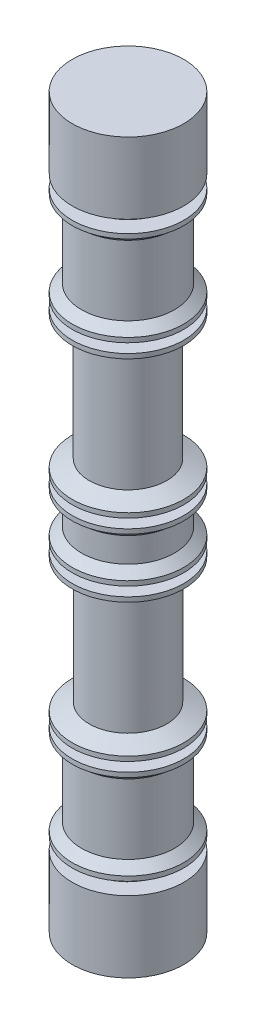
ISO-10303-21;
HEADER;
FILE_DESCRIPTION(('STEP AP214'),'2;1');
FILE_NAME('part.step','',(''),(''),'','','');
FILE_SCHEMA(('AUTOMOTIVE_DESIGN { 1 0 10303 214 1 1 1 1 }'));
ENDSEC;
DATA;
#1=APPLICATION_CONTEXT('core data for automotive mechanical design processes');
#2=APPLICATION_PROTOCOL_DEFINITION('international standard','automotive_design',2000,#1);
#3=PRODUCT_CONTEXT('',#1,'mechanical');
#4=PRODUCT('Part','Part','',(#3));
#5=PRODUCT_RELATED_PRODUCT_CATEGORY('part','',(#4));
#6=PRODUCT_DEFINITION_FORMATION('','',#4);
#7=PRODUCT_DEFINITION_CONTEXT('part definition',#1,'design');
#8=PRODUCT_DEFINITION('design','',#6,#7);
#9=PRODUCT_DEFINITION_SHAPE('','',#8);
#10=(LENGTH_UNIT() NAMED_UNIT(*) SI_UNIT(.MILLI.,.METRE.));
#11=(NAMED_UNIT(*) PLANE_ANGLE_UNIT() SI_UNIT($,.RADIAN.));
#12=(NAMED_UNIT(*) SI_UNIT($,.STERADIAN.) SOLID_ANGLE_UNIT());
#13=UNCERTAINTY_MEASURE_WITH_UNIT(LENGTH_MEASURE(1.E-05),#10,'distance_accuracy_value','');
#14=(GEOMETRIC_REPRESENTATION_CONTEXT(3) GLOBAL_UNCERTAINTY_ASSIGNED_CONTEXT((#13)) GLOBAL_UNIT_ASSIGNED_CONTEXT((#10,
#11,#12)) REPRESENTATION_CONTEXT('',''));
#15=CARTESIAN_POINT('',(0.,0.,0.));
#16=DIRECTION('',(0.,0.,1.));
#17=DIRECTION('',(1.,0.,0.));
#18=AXIS2_PLACEMENT_3D('',#15,#16,#17);
#19=CARTESIAN_POINT('',(0.,0.8,0.));
#20=DIRECTION('',(0.,-1.,0.));
#21=DIRECTION('',(0.,0.,-1.));
#22=AXIS2_PLACEMENT_3D('',#19,#20,#21);
#23=CYLINDRICAL_SURFACE('',#22,3.);
#24=CARTESIAN_POINT('',(0.,0.8,0.));
#25=DIRECTION('',(0.,1.,0.));
#26=DIRECTION('',(0.,0.,1.));
#27=AXIS2_PLACEMENT_3D('',#24,#25,#26);
#28=CIRCLE('',#27,3.);
#29=CARTESIAN_POINT('',(0.,0.8,3.));
#30=VERTEX_POINT('',#29);
#31=EDGE_CURVE('E42',#30,#30,#28,.T.);
#32=ORIENTED_EDGE('',*,*,#31,.F.);
#33=EDGE_LOOP('',(#32));
#34=FACE_BOUND('',#33,.T.);
#35=CARTESIAN_POINT('',(0.,-0.799999999999998,0.));
#36=DIRECTION('',(0.,1.,0.));
#37=DIRECTION('',(-1.,0.,0.));
#38=AXIS2_PLACEMENT_3D('',#35,#36,#37);
#39=CIRCLE('',#38,3.);
#40=CARTESIAN_POINT('',(-3.,-0.799999999999997,0.));
#41=VERTEX_POINT('',#40);
#42=EDGE_CURVE('E156',#41,#41,#39,.T.);
#43=ORIENTED_EDGE('',*,*,#42,.T.);
#44=EDGE_LOOP('',(#43));
#45=FACE_BOUND('',#44,.T.);
#46=ADVANCED_FACE('F39',(#34,#45),#23,.T.);
#47=CARTESIAN_POINT('',(0.,0.799999999999998,0.));
#48=DIRECTION('',(0.,1.,0.));
#49=DIRECTION('',(-1.,0.,0.));
#50=AXIS2_PLACEMENT_3D('',#47,#48,#49);
#51=CONICAL_SURFACE('',#50,3.,0.876058050598193);
#52=CARTESIAN_POINT('',(0.,1.3,0.));
#53=DIRECTION('',(0.,1.,0.));
#54=DIRECTION('',(-1.,0.,0.));
#55=AXIS2_PLACEMENT_3D('',#52,#53,#54);
#56=CIRCLE('',#55,3.6);
#57=CARTESIAN_POINT('',(-3.6,1.3,0.));
#58=VERTEX_POINT('',#57);
#59=EDGE_CURVE('E229',#58,#58,#56,.T.);
#60=ORIENTED_EDGE('',*,*,#59,.F.);
#61=EDGE_LOOP('',(#60));
#62=FACE_BOUND('',#61,.T.);
#63=ORIENTED_EDGE('',*,*,#31,.T.);
#64=EDGE_LOOP('',(#63));
#65=FACE_BOUND('',#64,.T.);
#66=ADVANCED_FACE('F238',(#62,#65),#51,.T.);
#67=CARTESIAN_POINT('',(0.,1.6,0.));
#68=DIRECTION('',(0.,1.,0.));
#69=DIRECTION('',(-1.,0.,0.));
#70=AXIS2_PLACEMENT_3D('',#67,#68,#69);
#71=CYLINDRICAL_SURFACE('',#70,3.6);
#72=CARTESIAN_POINT('',(0.,1.6,0.));
#73=DIRECTION('',(0.,1.,0.));
#74=DIRECTION('',(-1.,0.,0.));
#75=AXIS2_PLACEMENT_3D('',#72,#73,#74);
#76=CIRCLE('',#75,3.6);
#77=CARTESIAN_POINT('',(-3.6,1.6,0.));
#78=VERTEX_POINT('',#77);
#79=EDGE_CURVE('E223',#78,#78,#76,.T.);
#80=ORIENTED_EDGE('',*,*,#79,.F.);
#81=EDGE_LOOP('',(#80));
#82=FACE_BOUND('',#81,.T.);
#83=ORIENTED_EDGE('',*,*,#59,.T.);
#84=EDGE_LOOP('',(#83));
#85=FACE_BOUND('',#84,.T.);
#86=ADVANCED_FACE('F340',(#82,#85),#71,.T.);
#87=CARTESIAN_POINT('',(3.6,1.6,0.));
#88=DIRECTION('',(0.,-1.,0.));
#89=DIRECTION('',(1.,0.,0.));
#90=AXIS2_PLACEMENT_3D('',#87,#88,#89);
#91=PLANE('',#90);
#92=CARTESIAN_POINT('',(0.,1.6,0.));
#93=DIRECTION('',(0.,1.,0.));
#94=DIRECTION('',(-1.,0.,0.));
#95=AXIS2_PLACEMENT_3D('',#92,#93,#94);
#96=CIRCLE('',#95,2.5);
#97=CARTESIAN_POINT('',(-2.5,1.6,0.));
#98=VERTEX_POINT('',#97);
#99=EDGE_CURVE('E195',#98,#98,#96,.T.);
#100=ORIENTED_EDGE('',*,*,#99,.F.);
#101=EDGE_LOOP('',(#100));
#102=FACE_BOUND('',#101,.T.);
#103=ORIENTED_EDGE('',*,*,#79,.T.);
#104=EDGE_LOOP('',(#103));
#105=FACE_BOUND('',#104,.T.);
#106=ADVANCED_FACE('F336',(#102,#105),#91,.F.);
#107=CARTESIAN_POINT('',(0.,2.2,0.));
#108=DIRECTION('',(0.,-1.,0.));
#109=DIRECTION('',(1.,0.,0.));
#110=AXIS2_PLACEMENT_3D('',#107,#108,#109);
#111=CYLINDRICAL_SURFACE('',#110,2.5);
#112=CARTESIAN_POINT('',(0.,2.2,0.));
#113=DIRECTION('',(0.,1.,0.));
#114=DIRECTION('',(-1.,0.,0.));
#115=AXIS2_PLACEMENT_3D('',#112,#113,#114);
#116=CIRCLE('',#115,2.5);
#117=CARTESIAN_POINT('',(-2.5,2.2,0.));
#118=VERTEX_POINT('',#117);
#119=EDGE_CURVE('E219',#118,#118,#116,.T.);
#120=ORIENTED_EDGE('',*,*,#119,.F.);
#121=EDGE_LOOP('',(#120));
#122=FACE_BOUND('',#121,.T.);
#123=ORIENTED_EDGE('',*,*,#99,.T.);
#124=EDGE_LOOP('',(#123));
#125=FACE_BOUND('',#124,.T.);
#126=ADVANCED_FACE('F332',(#122,#125),#111,.T.);
#127=CARTESIAN_POINT('',(0.,2.2,0.));
#128=DIRECTION('',(0.,-1.,0.));
#129=DIRECTION('',(0.,0.,-1.));
#130=AXIS2_PLACEMENT_3D('',#127,#128,#129);
#131=PLANE('',#130);
#132=ORIENTED_EDGE('',*,*,#119,.T.);
#133=EDGE_LOOP('',(#132));
#134=FACE_BOUND('',#133,.T.);
#135=CARTESIAN_POINT('',(0.,2.2,0.));
#136=DIRECTION('',(0.,-1.,0.));
#137=DIRECTION('',(0.,0.,-1.));
#138=AXIS2_PLACEMENT_3D('',#135,#136,#137);
#139=CIRCLE('',#138,3.6);
#140=CARTESIAN_POINT('',(0.,2.2,-3.6));
#141=VERTEX_POINT('',#140);
#142=EDGE_CURVE('E215',#141,#141,#139,.T.);
#143=ORIENTED_EDGE('',*,*,#142,.T.);
#144=EDGE_LOOP('',(#143));
#145=FACE_BOUND('',#144,.T.);
#146=ADVANCED_FACE('F328',(#134,#145),#131,.T.);
#147=CARTESIAN_POINT('',(0.,2.2,0.));
#148=DIRECTION('',(0.,-1.,0.));
#149=DIRECTION('',(0.,0.,-1.));
#150=AXIS2_PLACEMENT_3D('',#147,#148,#149);
#151=CYLINDRICAL_SURFACE('',#150,3.6);
#152=CARTESIAN_POINT('',(0.,2.5,0.));
#153=DIRECTION('',(0.,-1.,0.));
#154=DIRECTION('',(0.,0.,-1.));
#155=AXIS2_PLACEMENT_3D('',#152,#153,#154);
#156=CIRCLE('',#155,3.6);
#157=CARTESIAN_POINT('',(0.,2.5,-3.6));
#158=VERTEX_POINT('',#157);
#159=EDGE_CURVE('E208',#158,#158,#156,.T.);
#160=ORIENTED_EDGE('',*,*,#159,.T.);
#161=EDGE_LOOP('',(#160));
#162=FACE_BOUND('',#161,.T.);
#163=ORIENTED_EDGE('',*,*,#142,.F.);
#164=EDGE_LOOP('',(#163));
#165=FACE_BOUND('',#164,.T.);
#166=ADVANCED_FACE('F324',(#162,#165),#151,.T.);
#167=CARTESIAN_POINT('',(0.,2.5,0.));
#168=DIRECTION('',(0.,-1.,0.));
#169=DIRECTION('',(0.,0.,-1.));
#170=AXIS2_PLACEMENT_3D('',#167,#168,#169);
#171=CONICAL_SURFACE('',#170,3.6,1.14416883366802);
#172=CARTESIAN_POINT('',(0.,3.,0.));
#173=DIRECTION('',(0.,1.,0.));
#174=DIRECTION('',(-1.,0.,0.));
#175=AXIS2_PLACEMENT_3D('',#172,#173,#174);
#176=CIRCLE('',#175,2.5);
#177=CARTESIAN_POINT('',(2.5,3.,0.));
#178=VERTEX_POINT('',#177);
#179=EDGE_CURVE('E203',#178,#178,#176,.T.);
#180=ORIENTED_EDGE('',*,*,#179,.F.);
#181=EDGE_LOOP('',(#180));
#182=FACE_BOUND('',#181,.T.);
#183=ORIENTED_EDGE('',*,*,#159,.F.);
#184=EDGE_LOOP('',(#183));
#185=FACE_BOUND('',#184,.T.);
#186=ADVANCED_FACE('F320',(#182,#185),#171,.T.);
#187=CARTESIAN_POINT('',(0.,10.6,0.));
#188=DIRECTION('',(0.,-1.,0.));
#189=DIRECTION('',(1.,0.,0.));
#190=AXIS2_PLACEMENT_3D('',#187,#188,#189);
#191=CYLINDRICAL_SURFACE('',#190,2.5);
#192=CARTESIAN_POINT('',(0.,10.6,0.));
#193=DIRECTION('',(0.,1.,0.));
#194=DIRECTION('',(-1.,0.,0.));
#195=AXIS2_PLACEMENT_3D('',#192,#193,#194);
#196=CIRCLE('',#195,2.5);
#197=CARTESIAN_POINT('',(2.49999999999999,10.6,0.));
#198=VERTEX_POINT('',#197);
#199=EDGE_CURVE('E204',#198,#198,#196,.T.);
#200=CARTESIAN_POINT('',(2.49999999999999,10.6,0.));
#201=CARTESIAN_POINT('',(2.49999999999999,10.5208333333333,0.));
#202=CARTESIAN_POINT('',(2.49999999999999,10.4416666666667,0.));
#203=CARTESIAN_POINT('',(2.49999999999999,10.2833333333333,0.));
#204=CARTESIAN_POINT('',(2.5,10.2041666666667,0.));
#205=CARTESIAN_POINT('',(2.5,10.0458333333333,0.));
#206=CARTESIAN_POINT('',(2.5,9.96666666666667,0.));
#207=CARTESIAN_POINT('',(2.5,9.80833333333333,0.));
#208=CARTESIAN_POINT('',(2.5,9.72916666666667,0.));
#209=CARTESIAN_POINT('',(2.5,9.57083333333333,0.));
#210=CARTESIAN_POINT('',(2.5,9.49166666666667,0.));
#211=CARTESIAN_POINT('',(2.5,9.33333333333333,0.));
#212=CARTESIAN_POINT('',(2.5,9.25416666666667,0.));
#213=CARTESIAN_POINT('',(2.5,9.09583333333333,0.));
#214=CARTESIAN_POINT('',(2.5,9.01666666666667,0.));
#215=CARTESIAN_POINT('',(2.5,8.85833333333333,0.));
#216=CARTESIAN_POINT('',(2.5,8.77916666666667,0.));
#217=CARTESIAN_POINT('',(2.5,8.62083333333334,0.));
#218=CARTESIAN_POINT('',(2.5,8.54166666666667,0.));
#219=CARTESIAN_POINT('',(2.5,8.38333333333333,0.));
#220=CARTESIAN_POINT('',(2.5,8.30416666666667,0.));
#221=CARTESIAN_POINT('',(2.5,8.14583333333333,0.));
#222=CARTESIAN_POINT('',(2.5,8.06666666666667,0.));
#223=CARTESIAN_POINT('',(2.5,7.90833333333333,0.));
#224=CARTESIAN_POINT('',(2.5,7.82916666666667,0.));
#225=CARTESIAN_POINT('',(2.5,7.67083333333334,0.));
#226=CARTESIAN_POINT('',(2.5,7.59166666666667,0.));
#227=CARTESIAN_POINT('',(2.5,7.43333333333334,0.));
#228=CARTESIAN_POINT('',(2.5,7.35416666666667,0.));
#229=CARTESIAN_POINT('',(2.5,7.19583333333334,0.));
#230=CARTESIAN_POINT('',(2.5,7.11666666666667,0.));
#231=CARTESIAN_POINT('',(2.5,6.95833333333333,0.));
#232=CARTESIAN_POINT('',(2.5,6.87916666666667,0.));
#233=CARTESIAN_POINT('',(2.5,6.72083333333333,0.));
#234=CARTESIAN_POINT('',(2.5,6.64166666666667,0.));
#235=CARTESIAN_POINT('',(2.5,6.48333333333334,0.));
#236=CARTESIAN_POINT('',(2.5,6.40416666666667,0.));
#237=CARTESIAN_POINT('',(2.5,6.24583333333334,0.));
#238=CARTESIAN_POINT('',(2.5,6.16666666666667,0.));
#239=CARTESIAN_POINT('',(2.5,6.00833333333334,0.));
#240=CARTESIAN_POINT('',(2.5,5.92916666666667,0.));
#241=CARTESIAN_POINT('',(2.5,5.77083333333334,0.));
#242=CARTESIAN_POINT('',(2.5,5.69166666666667,0.));
#243=CARTESIAN_POINT('',(2.5,5.53333333333333,0.));
#244=CARTESIAN_POINT('',(2.5,5.45416666666667,0.));
#245=CARTESIAN_POINT('',(2.5,5.29583333333334,0.));
#246=CARTESIAN_POINT('',(2.5,5.21666666666667,0.));
#247=CARTESIAN_POINT('',(2.5,5.05833333333333,0.));
#248=CARTESIAN_POINT('',(2.5,4.97916666666667,0.));
#249=CARTESIAN_POINT('',(2.5,4.82083333333333,0.));
#250=CARTESIAN_POINT('',(2.5,4.74166666666667,0.));
#251=CARTESIAN_POINT('',(2.5,4.58333333333333,0.));
#252=CARTESIAN_POINT('',(2.5,4.50416666666667,0.));
#253=CARTESIAN_POINT('',(2.5,4.34583333333333,0.));
#254=CARTESIAN_POINT('',(2.5,4.26666666666667,0.));
#255=CARTESIAN_POINT('',(2.5,4.10833333333334,0.));
#256=CARTESIAN_POINT('',(2.5,4.02916666666667,0.));
#257=CARTESIAN_POINT('',(2.5,3.87083333333333,0.));
#258=CARTESIAN_POINT('',(2.5,3.79166666666667,0.));
#259=CARTESIAN_POINT('',(2.5,3.63333333333333,0.));
#260=CARTESIAN_POINT('',(2.5,3.55416666666667,0.));
#261=CARTESIAN_POINT('',(2.5,3.39583333333333,0.));
#262=CARTESIAN_POINT('',(2.5,3.31666666666667,0.));
#263=CARTESIAN_POINT('',(2.5,3.15833333333333,0.));
#264=CARTESIAN_POINT('',(2.5,3.07916666666667,0.));
#265=CARTESIAN_POINT('',(2.5,3.,0.));
#266=B_SPLINE_CURVE_WITH_KNOTS('',3,(#200,#201,#202,#203,#204,#205,#206,#207,#208,#209,#210,
#211,#212,#213,#214,#215,#216,#217,#218,#219,#220,#221,#222,#223,#224,#225,#226,#227,#228,#229,
#230,#231,#232,#233,#234,#235,#236,#237,#238,#239,#240,#241,#242,#243,#244,#245,#246,#247,#248,
#249,#250,#251,#252,#253,#254,#255,#256,#257,#258,#259,#260,#261,#262,#263,#264,#265),
.UNSPECIFIED.,.F.,.F.,(4,2,2,2,2,2,2,2,2,2,2,2,2,2,2,2,2,2,2,2,2,2,2,2,2,2,2,2,2,2,2,2,4),(0.,
0.2375,0.475,0.7125,0.95,1.1875,1.425,1.6625,1.9,2.1375,2.375,2.6125,2.85,3.0875,3.325,3.5625,
3.8,4.0375,4.275,4.5125,4.75,4.9875,5.225,5.4625,5.7,5.9375,6.175,6.4125,6.65,6.8875,7.125,
7.3625,7.6),.UNSPECIFIED.);
#267=EDGE_CURVE('BSEAM316',#198,#178,#266,.T.);
#268=ORIENTED_EDGE('',*,*,#199,.F.);
#269=ORIENTED_EDGE('',*,*,#179,.T.);
#270=ORIENTED_EDGE('',*,*,#267,.T.);
#271=ORIENTED_EDGE('',*,*,#267,.F.);
#272=EDGE_LOOP('',(#268,#270,#269,#271));
#273=FACE_BOUND('',#272,.T.);
#274=ADVANCED_FACE('F316',(#273),#191,.T.);
#275=CARTESIAN_POINT('',(0.,11.4,0.));
#276=DIRECTION('',(0.,1.,0.));
#277=DIRECTION('',(0.,0.,1.));
#278=AXIS2_PLACEMENT_3D('',#275,#276,#277);
#279=PLANE('',#278);
#280=CARTESIAN_POINT('',(0.,11.4,0.));
#281=DIRECTION('',(0.,1.,0.));
#282=DIRECTION('',(0.,0.,1.));
#283=AXIS2_PLACEMENT_3D('',#280,#281,#282);
#284=CIRCLE('',#283,2.5);
#285=CARTESIAN_POINT('',(0.,11.4,2.5));
#286=VERTEX_POINT('',#285);
#287=EDGE_CURVE('E46',#286,#286,#284,.T.);
#288=ORIENTED_EDGE('',*,*,#287,.F.);
#289=EDGE_LOOP('',(#288));
#290=FACE_BOUND('',#289,.T.);
#291=CARTESIAN_POINT('',(0.,11.4,0.));
#292=DIRECTION('',(0.,-1.,0.));
#293=DIRECTION('',(0.,0.,-1.));
#294=AXIS2_PLACEMENT_3D('',#291,#292,#293);
#295=CIRCLE('',#294,3.6);
#296=CARTESIAN_POINT('',(0.,11.4,-3.6));
#297=VERTEX_POINT('',#296);
#298=EDGE_CURVE('E199',#297,#297,#295,.T.);
#299=ORIENTED_EDGE('',*,*,#298,.F.);
#300=EDGE_LOOP('',(#299));
#301=FACE_BOUND('',#300,.T.);
#302=ADVANCED_FACE('F312',(#290,#301),#279,.T.);
#303=CARTESIAN_POINT('',(0.,10.6,0.));
#304=DIRECTION('',(0.,-1.,0.));
#305=DIRECTION('',(0.,0.,-1.));
#306=AXIS2_PLACEMENT_3D('',#303,#304,#305);
#307=CYLINDRICAL_SURFACE('',#306,3.6);
#308=ORIENTED_EDGE('',*,*,#298,.T.);
#309=EDGE_LOOP('',(#308));
#310=FACE_BOUND('',#309,.T.);
#311=CARTESIAN_POINT('',(0.,11.1,0.));
#312=DIRECTION('',(0.,-1.,0.));
#313=DIRECTION('',(0.,0.,-1.));
#314=AXIS2_PLACEMENT_3D('',#311,#312,#313);
#315=CIRCLE('',#314,3.6);
#316=CARTESIAN_POINT('',(0.,11.1,-3.6));
#317=VERTEX_POINT('',#316);
#318=EDGE_CURVE('E191',#317,#317,#315,.T.);
#319=ORIENTED_EDGE('',*,*,#318,.F.);
#320=EDGE_LOOP('',(#319));
#321=FACE_BOUND('',#320,.T.);
#322=ADVANCED_FACE('F308',(#310,#321),#307,.T.);
#323=CARTESIAN_POINT('',(0.,10.6,0.));
#324=DIRECTION('',(0.,1.,0.));
#325=DIRECTION('',(0.,0.,1.));
#326=AXIS2_PLACEMENT_3D('',#323,#324,#325);
#327=CONICAL_SURFACE('',#326,2.49999999999999,1.14416883366802);
#328=ORIENTED_EDGE('',*,*,#318,.T.);
#329=EDGE_LOOP('',(#328));
#330=FACE_BOUND('',#329,.T.);
#331=ORIENTED_EDGE('',*,*,#199,.T.);
#332=EDGE_LOOP('',(#331));
#333=FACE_BOUND('',#332,.T.);
#334=ADVANCED_FACE('F304',(#330,#333),#327,.T.);
#335=CARTESIAN_POINT('',(0.,12.,0.));
#336=DIRECTION('',(0.,-1.,0.));
#337=DIRECTION('',(0.,0.,-1.));
#338=AXIS2_PLACEMENT_3D('',#335,#336,#337);
#339=CYLINDRICAL_SURFACE('',#338,2.5);
#340=CARTESIAN_POINT('',(0.,12.,0.));
#341=DIRECTION('',(0.,1.,0.));
#342=DIRECTION('',(0.,0.,1.));
#343=AXIS2_PLACEMENT_3D('',#340,#341,#342);
#344=CIRCLE('',#343,2.5);
#345=CARTESIAN_POINT('',(0.,12.,2.5));
#346=VERTEX_POINT('',#345);
#347=EDGE_CURVE('E188',#346,#346,#344,.T.);
#348=ORIENTED_EDGE('',*,*,#347,.F.);
#349=EDGE_LOOP('',(#348));
#350=FACE_BOUND('',#349,.T.);
#351=ORIENTED_EDGE('',*,*,#287,.T.);
#352=EDGE_LOOP('',(#351));
#353=FACE_BOUND('',#352,.T.);
#354=ADVANCED_FACE('F300',(#350,#353),#339,.T.);
#355=CARTESIAN_POINT('',(0.,12.,0.));
#356=DIRECTION('',(0.,1.,0.));
#357=DIRECTION('',(-1.,0.,0.));
#358=AXIS2_PLACEMENT_3D('',#355,#356,#357);
#359=PLANE('',#358);
#360=ORIENTED_EDGE('',*,*,#347,.T.);
#361=EDGE_LOOP('',(#360));
#362=FACE_BOUND('',#361,.T.);
#363=CARTESIAN_POINT('',(0.,12.,0.));
#364=DIRECTION('',(0.,1.,0.));
#365=DIRECTION('',(-1.,0.,0.));
#366=AXIS2_PLACEMENT_3D('',#363,#364,#365);
#367=CIRCLE('',#366,3.6);
#368=CARTESIAN_POINT('',(-3.6,12.,0.));
#369=VERTEX_POINT('',#368);
#370=EDGE_CURVE('E184',#369,#369,#367,.T.);
#371=ORIENTED_EDGE('',*,*,#370,.F.);
#372=EDGE_LOOP('',(#371));
#373=FACE_BOUND('',#372,.T.);
#374=ADVANCED_FACE('F296',(#362,#373),#359,.F.);
#375=CARTESIAN_POINT('',(0.,12.8,0.));
#376=DIRECTION('',(0.,1.,0.));
#377=DIRECTION('',(-1.,0.,0.));
#378=AXIS2_PLACEMENT_3D('',#375,#376,#377);
#379=CYLINDRICAL_SURFACE('',#378,3.6);
#380=CARTESIAN_POINT('',(0.,12.3,0.));
#381=DIRECTION('',(0.,1.,0.));
#382=DIRECTION('',(-1.,0.,0.));
#383=AXIS2_PLACEMENT_3D('',#380,#381,#382);
#384=CIRCLE('',#383,3.6);
#385=CARTESIAN_POINT('',(-3.6,12.3,0.));
#386=VERTEX_POINT('',#385);
#387=EDGE_CURVE('E181',#386,#386,#384,.T.);
#388=ORIENTED_EDGE('',*,*,#387,.F.);
#389=EDGE_LOOP('',(#388));
#390=FACE_BOUND('',#389,.T.);
#391=ORIENTED_EDGE('',*,*,#370,.T.);
#392=EDGE_LOOP('',(#391));
#393=FACE_BOUND('',#392,.T.);
#394=ADVANCED_FACE('F292',(#390,#393),#379,.T.);
#395=CARTESIAN_POINT('',(0.,12.3,0.));
#396=DIRECTION('',(0.,-1.,0.));
#397=DIRECTION('',(1.,0.,0.));
#398=AXIS2_PLACEMENT_3D('',#395,#396,#397);
#399=CONICAL_SURFACE('',#398,3.6,0.876058050598191);
#400=CARTESIAN_POINT('',(0.,12.8,0.));
#401=DIRECTION('',(0.,1.,0.));
#402=DIRECTION('',(-1.,0.,0.));
#403=AXIS2_PLACEMENT_3D('',#400,#401,#402);
#404=CIRCLE('',#403,3.);
#405=CARTESIAN_POINT('',(-3.,12.8,0.));
#406=VERTEX_POINT('',#405);
#407=EDGE_CURVE('E178',#406,#406,#404,.T.);
#408=ORIENTED_EDGE('',*,*,#407,.F.);
#409=EDGE_LOOP('',(#408));
#410=FACE_BOUND('',#409,.T.);
#411=ORIENTED_EDGE('',*,*,#387,.T.);
#412=EDGE_LOOP('',(#411));
#413=FACE_BOUND('',#412,.T.);
#414=ADVANCED_FACE('F288',(#410,#413),#399,.T.);
#415=CARTESIAN_POINT('',(0.,17.3,0.));
#416=DIRECTION('',(0.,-1.,0.));
#417=DIRECTION('',(1.,0.,0.));
#418=AXIS2_PLACEMENT_3D('',#415,#416,#417);
#419=CYLINDRICAL_SURFACE('',#418,3.);
#420=CARTESIAN_POINT('',(0.,17.3,0.));
#421=DIRECTION('',(0.,1.,0.));
#422=DIRECTION('',(-1.,0.,0.));
#423=AXIS2_PLACEMENT_3D('',#420,#421,#422);
#424=CIRCLE('',#423,3.);
#425=CARTESIAN_POINT('',(-3.,17.3,0.));
#426=VERTEX_POINT('',#425);
#427=EDGE_CURVE('E175',#426,#426,#424,.T.);
#428=ORIENTED_EDGE('',*,*,#427,.F.);
#429=EDGE_LOOP('',(#428));
#430=FACE_BOUND('',#429,.T.);
#431=ORIENTED_EDGE('',*,*,#407,.T.);
#432=EDGE_LOOP('',(#431));
#433=FACE_BOUND('',#432,.T.);
#434=ADVANCED_FACE('F284',(#430,#433),#419,.T.);
#435=CARTESIAN_POINT('',(0.,17.3,0.));
#436=DIRECTION('',(0.,1.,0.));
#437=DIRECTION('',(-1.,0.,0.));
#438=AXIS2_PLACEMENT_3D('',#435,#436,#437);
#439=CONICAL_SURFACE('',#438,3.,0.876058050598194);
#440=CARTESIAN_POINT('',(0.,17.8,0.));
#441=DIRECTION('',(0.,1.,0.));
#442=DIRECTION('',(-1.,0.,0.));
#443=AXIS2_PLACEMENT_3D('',#440,#441,#442);
#444=CIRCLE('',#443,3.6);
#445=CARTESIAN_POINT('',(-3.6,17.8,0.));
#446=VERTEX_POINT('',#445);
#447=EDGE_CURVE('E172',#446,#446,#444,.T.);
#448=ORIENTED_EDGE('',*,*,#447,.F.);
#449=EDGE_LOOP('',(#448));
#450=FACE_BOUND('',#449,.T.);
#451=ORIENTED_EDGE('',*,*,#427,.T.);
#452=EDGE_LOOP('',(#451));
#453=FACE_BOUND('',#452,.T.);
#454=ADVANCED_FACE('F280',(#450,#453),#439,.T.);
#455=CARTESIAN_POINT('',(0.,18.1,0.));
#456=DIRECTION('',(0.,1.,0.));
#457=DIRECTION('',(-1.,0.,0.));
#458=AXIS2_PLACEMENT_3D('',#455,#456,#457);
#459=CYLINDRICAL_SURFACE('',#458,3.6);
#460=CARTESIAN_POINT('',(0.,18.1,0.));
#461=DIRECTION('',(0.,1.,0.));
#462=DIRECTION('',(-1.,0.,0.));
#463=AXIS2_PLACEMENT_3D('',#460,#461,#462);
#464=CIRCLE('',#463,3.6);
#465=CARTESIAN_POINT('',(-3.6,18.1,0.));
#466=VERTEX_POINT('',#465);
#467=EDGE_CURVE('E168',#466,#466,#464,.T.);
#468=ORIENTED_EDGE('',*,*,#467,.F.);
#469=EDGE_LOOP('',(#468));
#470=FACE_BOUND('',#469,.T.);
#471=ORIENTED_EDGE('',*,*,#447,.T.);
#472=EDGE_LOOP('',(#471));
#473=FACE_BOUND('',#472,.T.);
#474=ADVANCED_FACE('F276',(#470,#473),#459,.T.);
#475=CARTESIAN_POINT('',(3.6,18.1,0.));
#476=DIRECTION('',(0.,-1.,0.));
#477=DIRECTION('',(1.,0.,0.));
#478=AXIS2_PLACEMENT_3D('',#475,#476,#477);
#479=PLANE('',#478);
#480=CARTESIAN_POINT('',(0.,18.1,0.));
#481=DIRECTION('',(0.,1.,0.));
#482=DIRECTION('',(-1.,0.,0.));
#483=AXIS2_PLACEMENT_3D('',#480,#481,#482);
#484=CIRCLE('',#483,2.5);
#485=CARTESIAN_POINT('',(-2.5,18.1,0.));
#486=VERTEX_POINT('',#485);
#487=EDGE_CURVE('E11',#486,#486,#484,.T.);
#488=ORIENTED_EDGE('',*,*,#487,.F.);
#489=EDGE_LOOP('',(#488));
#490=FACE_BOUND('',#489,.T.);
#491=ORIENTED_EDGE('',*,*,#467,.T.);
#492=EDGE_LOOP('',(#491));
#493=FACE_BOUND('',#492,.T.);
#494=ADVANCED_FACE('F272',(#490,#493),#479,.F.);
#495=CARTESIAN_POINT('',(0.,18.9,0.));
#496=DIRECTION('',(0.,-1.,0.));
#497=DIRECTION('',(1.,0.,0.));
#498=AXIS2_PLACEMENT_3D('',#495,#496,#497);
#499=CYLINDRICAL_SURFACE('',#498,2.5);
#500=CARTESIAN_POINT('',(0.,18.9,0.));
#501=DIRECTION('',(0.,1.,0.));
#502=DIRECTION('',(-1.,0.,0.));
#503=AXIS2_PLACEMENT_3D('',#500,#501,#502);
#504=CIRCLE('',#503,2.5);
#505=CARTESIAN_POINT('',(-2.5,18.9,0.));
#506=VERTEX_POINT('',#505);
#507=EDGE_CURVE('E164',#506,#506,#504,.T.);
#508=ORIENTED_EDGE('',*,*,#507,.F.);
#509=EDGE_LOOP('',(#508));
#510=FACE_BOUND('',#509,.T.);
#511=ORIENTED_EDGE('',*,*,#487,.T.);
#512=EDGE_LOOP('',(#511));
#513=FACE_BOUND('',#512,.T.);
#514=ADVANCED_FACE('F268',(#510,#513),#499,.T.);
#515=CARTESIAN_POINT('',(0.,23.5,0.));
#516=DIRECTION('',(0.,-1.,0.));
#517=DIRECTION('',(1.,0.,0.));
#518=AXIS2_PLACEMENT_3D('',#515,#516,#517);
#519=CYLINDRICAL_SURFACE('',#518,3.6);
#520=CARTESIAN_POINT('',(0.,23.5,0.));
#521=DIRECTION('',(0.,1.,0.));
#522=DIRECTION('',(-1.,0.,0.));
#523=AXIS2_PLACEMENT_3D('',#520,#521,#522);
#524=CIRCLE('',#523,3.6);
#525=CARTESIAN_POINT('',(-3.6,23.5,0.));
#526=VERTEX_POINT('',#525);
#527=EDGE_CURVE('E161',#526,#526,#524,.T.);
#528=ORIENTED_EDGE('',*,*,#527,.F.);
#529=EDGE_LOOP('',(#528));
#530=FACE_BOUND('',#529,.T.);
#531=CARTESIAN_POINT('',(0.,18.9,0.));
#532=DIRECTION('',(0.,1.,0.));
#533=DIRECTION('',(-1.,0.,0.));
#534=AXIS2_PLACEMENT_3D('',#531,#532,#533);
#535=CIRCLE('',#534,3.6);
#536=CARTESIAN_POINT('',(-3.6,18.9,0.));
#537=VERTEX_POINT('',#536);
#538=EDGE_CURVE('E160',#537,#537,#535,.T.);
#539=ORIENTED_EDGE('',*,*,#538,.T.);
#540=EDGE_LOOP('',(#539));
#541=FACE_BOUND('',#540,.T.);
#542=ADVANCED_FACE('F263',(#530,#541),#519,.T.);
#543=CARTESIAN_POINT('',(0.,23.5,0.));
#544=DIRECTION('',(0.,1.,0.));
#545=DIRECTION('',(-1.,0.,0.));
#546=AXIS2_PLACEMENT_3D('',#543,#544,#545);
#547=PLANE('',#546);
#548=ORIENTED_EDGE('',*,*,#527,.T.);
#549=EDGE_LOOP('',(#548));
#550=FACE_BOUND('',#549,.T.);
#551=ADVANCED_FACE('F257',(#550),#547,.T.);
#552=CARTESIAN_POINT('',(0.,18.9,0.));
#553=DIRECTION('',(0.,1.,0.));
#554=DIRECTION('',(-1.,0.,0.));
#555=AXIS2_PLACEMENT_3D('',#552,#553,#554);
#556=PLANE('',#555);
#557=ORIENTED_EDGE('',*,*,#507,.T.);
#558=EDGE_LOOP('',(#557));
#559=FACE_BOUND('',#558,.T.);
#560=ORIENTED_EDGE('',*,*,#538,.F.);
#561=EDGE_LOOP('',(#560));
#562=FACE_BOUND('',#561,.T.);
#563=ADVANCED_FACE('F247',(#559,#562),#556,.F.);
#564=CARTESIAN_POINT('',(0.,-0.799999999999998,0.));
#565=DIRECTION('',(0.,-1.,0.));
#566=DIRECTION('',(-1.,0.,0.));
#567=AXIS2_PLACEMENT_3D('',#564,#565,#566);
#568=CONICAL_SURFACE('',#567,3.,0.876058050598193);
#569=CARTESIAN_POINT('',(0.,-1.3,0.));
#570=DIRECTION('',(0.,1.,0.));
#571=DIRECTION('',(-1.,0.,0.));
#572=AXIS2_PLACEMENT_3D('',#569,#570,#571);
#573=CIRCLE('',#572,3.6);
#574=CARTESIAN_POINT('',(-3.6,-1.3,0.));
#575=VERTEX_POINT('',#574);
#576=EDGE_CURVE('E152',#575,#575,#573,.T.);
#577=ORIENTED_EDGE('',*,*,#576,.T.);
#578=EDGE_LOOP('',(#577));
#579=FACE_BOUND('',#578,.T.);
#580=ORIENTED_EDGE('',*,*,#42,.F.);
#581=EDGE_LOOP('',(#580));
#582=FACE_BOUND('',#581,.T.);
#583=ADVANCED_FACE('F244',(#579,#582),#568,.T.);
#584=CARTESIAN_POINT('',(0.,-1.6,0.));
#585=DIRECTION('',(0.,-1.,0.));
#586=DIRECTION('',(-1.,0.,0.));
#587=AXIS2_PLACEMENT_3D('',#584,#585,#586);
#588=CYLINDRICAL_SURFACE('',#587,3.6);
#589=CARTESIAN_POINT('',(0.,-1.6,0.));
#590=DIRECTION('',(0.,1.,0.));
#591=DIRECTION('',(-1.,0.,0.));
#592=AXIS2_PLACEMENT_3D('',#589,#590,#591);
#593=CIRCLE('',#592,3.6);
#594=CARTESIAN_POINT('',(-3.6,-1.6,0.));
#595=VERTEX_POINT('',#594);
#596=EDGE_CURVE('E148',#595,#595,#593,.T.);
#597=ORIENTED_EDGE('',*,*,#596,.T.);
#598=EDGE_LOOP('',(#597));
#599=FACE_BOUND('',#598,.T.);
#600=ORIENTED_EDGE('',*,*,#576,.F.);
#601=EDGE_LOOP('',(#600));
#602=FACE_BOUND('',#601,.T.);
#603=ADVANCED_FACE('F246',(#599,#602),#588,.T.);
#604=CARTESIAN_POINT('',(3.6,-1.6,0.));
#605=DIRECTION('',(0.,1.,0.));
#606=DIRECTION('',(1.,0.,0.));
#607=AXIS2_PLACEMENT_3D('',#604,#605,#606);
#608=PLANE('',#607);
#609=CARTESIAN_POINT('',(0.,-1.6,0.));
#610=DIRECTION('',(0.,1.,0.));
#611=DIRECTION('',(-1.,0.,0.));
#612=AXIS2_PLACEMENT_3D('',#609,#610,#611);
#613=CIRCLE('',#612,2.5);
#614=CARTESIAN_POINT('',(-2.5,-1.6,0.));
#615=VERTEX_POINT('',#614);
#616=EDGE_CURVE('E145',#615,#615,#613,.T.);
#617=ORIENTED_EDGE('',*,*,#616,.T.);
#618=EDGE_LOOP('',(#617));
#619=FACE_BOUND('',#618,.T.);
#620=ORIENTED_EDGE('',*,*,#596,.F.);
#621=EDGE_LOOP('',(#620));
#622=FACE_BOUND('',#621,.T.);
#623=ADVANCED_FACE('F254',(#619,#622),#608,.F.);
#624=CARTESIAN_POINT('',(0.,-2.2,0.));
#625=DIRECTION('',(0.,1.,0.));
#626=DIRECTION('',(-1.,0.,0.));
#627=AXIS2_PLACEMENT_3D('',#624,#625,#626);
#628=CYLINDRICAL_SURFACE('',#627,2.5);
#629=CARTESIAN_POINT('',(0.,-2.2,0.));
#630=DIRECTION('',(0.,1.,0.));
#631=DIRECTION('',(-1.,0.,0.));
#632=AXIS2_PLACEMENT_3D('',#629,#630,#631);
#633=CIRCLE('',#632,2.5);
#634=CARTESIAN_POINT('',(-2.5,-2.2,0.));
#635=VERTEX_POINT('',#634);
#636=EDGE_CURVE('E141',#635,#635,#633,.T.);
#637=ORIENTED_EDGE('',*,*,#636,.T.);
#638=EDGE_LOOP('',(#637));
#639=FACE_BOUND('',#638,.T.);
#640=ORIENTED_EDGE('',*,*,#616,.F.);
#641=EDGE_LOOP('',(#640));
#642=FACE_BOUND('',#641,.T.);
#643=ADVANCED_FACE('F461',(#639,#642),#628,.T.);
#644=CARTESIAN_POINT('',(0.,-2.2,0.));
#645=DIRECTION('',(0.,1.,0.));
#646=DIRECTION('',(0.,0.,-1.));
#647=AXIS2_PLACEMENT_3D('',#644,#645,#646);
#648=PLANE('',#647);
#649=ORIENTED_EDGE('',*,*,#636,.F.);
#650=EDGE_LOOP('',(#649));
#651=FACE_BOUND('',#650,.T.);
#652=CARTESIAN_POINT('',(0.,-2.2,0.));
#653=DIRECTION('',(0.,-1.,0.));
#654=DIRECTION('',(0.,0.,-1.));
#655=AXIS2_PLACEMENT_3D('',#652,#653,#654);
#656=CIRCLE('',#655,3.6);
#657=CARTESIAN_POINT('',(0.,-2.2,-3.6));
#658=VERTEX_POINT('',#657);
#659=EDGE_CURVE('E137',#658,#658,#656,.T.);
#660=ORIENTED_EDGE('',*,*,#659,.F.);
#661=EDGE_LOOP('',(#660));
#662=FACE_BOUND('',#661,.T.);
#663=ADVANCED_FACE('F470',(#651,#662),#648,.T.);
#664=CARTESIAN_POINT('',(0.,-2.2,0.));
#665=DIRECTION('',(0.,1.,0.));
#666=DIRECTION('',(0.,0.,-1.));
#667=AXIS2_PLACEMENT_3D('',#664,#665,#666);
#668=CYLINDRICAL_SURFACE('',#667,3.6);
#669=CARTESIAN_POINT('',(0.,-2.5,0.));
#670=DIRECTION('',(0.,-1.,0.));
#671=DIRECTION('',(0.,0.,-1.));
#672=AXIS2_PLACEMENT_3D('',#669,#670,#671);
#673=CIRCLE('',#672,3.6);
#674=CARTESIAN_POINT('',(0.,-2.5,-3.6));
#675=VERTEX_POINT('',#674);
#676=EDGE_CURVE('E133',#675,#675,#673,.T.);
#677=ORIENTED_EDGE('',*,*,#676,.F.);
#678=EDGE_LOOP('',(#677));
#679=FACE_BOUND('',#678,.T.);
#680=ORIENTED_EDGE('',*,*,#659,.T.);
#681=EDGE_LOOP('',(#680));
#682=FACE_BOUND('',#681,.T.);
#683=ADVANCED_FACE('F480',(#679,#682),#668,.T.);
#684=CARTESIAN_POINT('',(0.,-2.5,0.));
#685=DIRECTION('',(0.,1.,0.));
#686=DIRECTION('',(0.,0.,-1.));
#687=AXIS2_PLACEMENT_3D('',#684,#685,#686);
#688=CONICAL_SURFACE('',#687,3.6,1.14416883366802);
#689=CARTESIAN_POINT('',(0.,-3.,0.));
#690=DIRECTION('',(0.,-1.,0.));
#691=DIRECTION('',(0.,0.,-1.));
#692=AXIS2_PLACEMENT_3D('',#689,#690,#691);
#693=CIRCLE('',#692,2.5);
#694=CARTESIAN_POINT('',(-2.5,-3.,0.));
#695=VERTEX_POINT('',#694);
#696=EDGE_CURVE('E129',#695,#695,#693,.T.);
#697=ORIENTED_EDGE('',*,*,#696,.F.);
#698=EDGE_LOOP('',(#697));
#699=FACE_BOUND('',#698,.T.);
#700=ORIENTED_EDGE('',*,*,#676,.T.);
#701=EDGE_LOOP('',(#700));
#702=FACE_BOUND('',#701,.T.);
#703=ADVANCED_FACE('F489',(#699,#702),#688,.T.);
#704=CARTESIAN_POINT('',(0.,-10.6,0.));
#705=DIRECTION('',(0.,1.,0.));
#706=DIRECTION('',(-1.,0.,0.));
#707=AXIS2_PLACEMENT_3D('',#704,#705,#706);
#708=CYLINDRICAL_SURFACE('',#707,2.5);
#709=CARTESIAN_POINT('',(0.,-10.6,0.));
#710=DIRECTION('',(0.,-1.,0.));
#711=DIRECTION('',(0.,0.,-1.));
#712=AXIS2_PLACEMENT_3D('',#709,#710,#711);
#713=CIRCLE('',#712,2.49999999999999);
#714=CARTESIAN_POINT('',(-2.50000000000001,-10.6,0.));
#715=VERTEX_POINT('',#714);
#716=EDGE_CURVE('E117',#715,#715,#713,.T.);
#717=CARTESIAN_POINT('',(-2.50000000000001,-10.6,0.));
#718=CARTESIAN_POINT('',(-2.50000000000001,-10.5208333333333,0.));
#719=CARTESIAN_POINT('',(-2.50000000000001,-10.4416666666667,0.));
#720=CARTESIAN_POINT('',(-2.50000000000001,-10.2833333333333,0.));
#721=CARTESIAN_POINT('',(-2.50000000000001,-10.2041666666667,0.));
#722=CARTESIAN_POINT('',(-2.50000000000001,-10.0458333333333,0.));
#723=CARTESIAN_POINT('',(-2.50000000000001,-9.96666666666667,0.));
#724=CARTESIAN_POINT('',(-2.50000000000001,-9.80833333333333,0.));
#725=CARTESIAN_POINT('',(-2.50000000000001,-9.72916666666667,0.));
#726=CARTESIAN_POINT('',(-2.50000000000001,-9.57083333333333,0.));
#727=CARTESIAN_POINT('',(-2.50000000000001,-9.49166666666667,0.));
#728=CARTESIAN_POINT('',(-2.50000000000001,-9.33333333333333,0.));
#729=CARTESIAN_POINT('',(-2.50000000000001,-9.25416666666667,0.));
#730=CARTESIAN_POINT('',(-2.50000000000001,-9.09583333333333,0.));
#731=CARTESIAN_POINT('',(-2.5,-9.01666666666667,0.));
#732=CARTESIAN_POINT('',(-2.5,-8.85833333333333,0.));
#733=CARTESIAN_POINT('',(-2.5,-8.77916666666667,0.));
#734=CARTESIAN_POINT('',(-2.5,-8.62083333333333,0.));
#735=CARTESIAN_POINT('',(-2.5,-8.54166666666667,0.));
#736=CARTESIAN_POINT('',(-2.5,-8.38333333333333,0.));
#737=CARTESIAN_POINT('',(-2.5,-8.30416666666667,0.));
#738=CARTESIAN_POINT('',(-2.5,-8.14583333333333,0.));
#739=CARTESIAN_POINT('',(-2.5,-8.06666666666667,0.));
#740=CARTESIAN_POINT('',(-2.5,-7.90833333333333,0.));
#741=CARTESIAN_POINT('',(-2.5,-7.82916666666667,0.));
#742=CARTESIAN_POINT('',(-2.5,-7.67083333333333,0.));
#743=CARTESIAN_POINT('',(-2.5,-7.59166666666667,0.));
#744=CARTESIAN_POINT('',(-2.5,-7.43333333333333,0.));
#745=CARTESIAN_POINT('',(-2.5,-7.35416666666667,0.));
#746=CARTESIAN_POINT('',(-2.5,-7.19583333333333,0.));
#747=CARTESIAN_POINT('',(-2.5,-7.11666666666667,0.));
#748=CARTESIAN_POINT('',(-2.5,-6.95833333333333,0.));
#749=CARTESIAN_POINT('',(-2.5,-6.87916666666667,0.));
#750=CARTESIAN_POINT('',(-2.5,-6.72083333333333,0.));
#751=CARTESIAN_POINT('',(-2.5,-6.64166666666667,0.));
#752=CARTESIAN_POINT('',(-2.5,-6.48333333333333,0.));
#753=CARTESIAN_POINT('',(-2.5,-6.40416666666667,0.));
#754=CARTESIAN_POINT('',(-2.5,-6.24583333333333,0.));
#755=CARTESIAN_POINT('',(-2.5,-6.16666666666667,0.));
#756=CARTESIAN_POINT('',(-2.5,-6.00833333333333,0.));
#757=CARTESIAN_POINT('',(-2.5,-5.92916666666667,0.));
#758=CARTESIAN_POINT('',(-2.5,-5.77083333333333,0.));
#759=CARTESIAN_POINT('',(-2.5,-5.69166666666667,0.));
#760=CARTESIAN_POINT('',(-2.5,-5.53333333333333,0.));
#761=CARTESIAN_POINT('',(-2.5,-5.45416666666667,0.));
#762=CARTESIAN_POINT('',(-2.5,-5.29583333333333,0.));
#763=CARTESIAN_POINT('',(-2.5,-5.21666666666667,0.));
#764=CARTESIAN_POINT('',(-2.5,-5.05833333333333,0.));
#765=CARTESIAN_POINT('',(-2.5,-4.97916666666667,0.));
#766=CARTESIAN_POINT('',(-2.5,-4.82083333333333,0.));
#767=CARTESIAN_POINT('',(-2.5,-4.74166666666667,0.));
#768=CARTESIAN_POINT('',(-2.5,-4.58333333333333,0.));
#769=CARTESIAN_POINT('',(-2.5,-4.50416666666667,0.));
#770=CARTESIAN_POINT('',(-2.5,-4.34583333333333,0.));
#771=CARTESIAN_POINT('',(-2.5,-4.26666666666667,0.));
#772=CARTESIAN_POINT('',(-2.5,-4.10833333333333,0.));
#773=CARTESIAN_POINT('',(-2.5,-4.02916666666667,0.));
#774=CARTESIAN_POINT('',(-2.5,-3.87083333333333,0.));
#775=CARTESIAN_POINT('',(-2.5,-3.79166666666667,0.));
#776=CARTESIAN_POINT('',(-2.5,-3.63333333333333,0.));
#777=CARTESIAN_POINT('',(-2.5,-3.55416666666667,0.));
#778=CARTESIAN_POINT('',(-2.5,-3.39583333333333,0.));
#779=CARTESIAN_POINT('',(-2.5,-3.31666666666667,0.));
#780=CARTESIAN_POINT('',(-2.5,-3.15833333333333,0.));
#781=CARTESIAN_POINT('',(-2.5,-3.07916666666667,0.));
#782=CARTESIAN_POINT('',(-2.5,-3.,0.));
#783=B_SPLINE_CURVE_WITH_KNOTS('',3,(#717,#718,#719,#720,#721,#722,#723,#724,#725,#726,#727,
#728,#729,#730,#731,#732,#733,#734,#735,#736,#737,#738,#739,#740,#741,#742,#743,#744,#745,#746,
#747,#748,#749,#750,#751,#752,#753,#754,#755,#756,#757,#758,#759,#760,#761,#762,#763,#764,#765,
#766,#767,#768,#769,#770,#771,#772,#773,#774,#775,#776,#777,#778,#779,#780,#781,#782),
.UNSPECIFIED.,.F.,.F.,(4,2,2,2,2,2,2,2,2,2,2,2,2,2,2,2,2,2,2,2,2,2,2,2,2,2,2,2,2,2,2,2,4),(0.,
0.2375,0.475,0.7125,0.95,1.1875,1.425,1.6625,1.9,2.1375,2.375,2.6125,2.85,3.0875,3.325,3.5625,
3.8,4.0375,4.275,4.5125,4.75,4.9875,5.225,5.4625,5.7,5.9375,6.175,6.4125,6.65,6.8875,7.125,
7.3625,7.6),.UNSPECIFIED.);
#784=EDGE_CURVE('BSEAM498',#715,#695,#783,.T.);
#785=ORIENTED_EDGE('',*,*,#716,.F.);
#786=ORIENTED_EDGE('',*,*,#696,.T.);
#787=ORIENTED_EDGE('',*,*,#784,.T.);
#788=ORIENTED_EDGE('',*,*,#784,.F.);
#789=EDGE_LOOP('',(#785,#787,#786,#788));
#790=FACE_BOUND('',#789,.T.);
#791=ADVANCED_FACE('F498',(#790),#708,.T.);
#792=CARTESIAN_POINT('',(0.,-11.4,0.));
#793=DIRECTION('',(0.,-1.,0.));
#794=DIRECTION('',(0.,0.,1.));
#795=AXIS2_PLACEMENT_3D('',#792,#793,#794);
#796=PLANE('',#795);
#797=CARTESIAN_POINT('',(0.,-11.4,0.));
#798=DIRECTION('',(0.,1.,0.));
#799=DIRECTION('',(0.,0.,1.));
#800=AXIS2_PLACEMENT_3D('',#797,#798,#799);
#801=CIRCLE('',#800,2.5);
#802=CARTESIAN_POINT('',(0.,-11.4,2.5));
#803=VERTEX_POINT('',#802);
#804=EDGE_CURVE('E113',#803,#803,#801,.T.);
#805=ORIENTED_EDGE('',*,*,#804,.T.);
#806=EDGE_LOOP('',(#805));
#807=FACE_BOUND('',#806,.T.);
#808=CARTESIAN_POINT('',(0.,-11.4,0.));
#809=DIRECTION('',(0.,-1.,0.));
#810=DIRECTION('',(0.,0.,-1.));
#811=AXIS2_PLACEMENT_3D('',#808,#809,#810);
#812=CIRCLE('',#811,3.6);
#813=CARTESIAN_POINT('',(0.,-11.4,-3.6));
#814=VERTEX_POINT('',#813);
#815=EDGE_CURVE('E125',#814,#814,#812,.T.);
#816=ORIENTED_EDGE('',*,*,#815,.T.);
#817=EDGE_LOOP('',(#816));
#818=FACE_BOUND('',#817,.T.);
#819=ADVANCED_FACE('F508',(#807,#818),#796,.T.);
#820=CARTESIAN_POINT('',(0.,-10.6,0.));
#821=DIRECTION('',(0.,1.,0.));
#822=DIRECTION('',(0.,0.,-1.));
#823=AXIS2_PLACEMENT_3D('',#820,#821,#822);
#824=CYLINDRICAL_SURFACE('',#823,3.6);
#825=ORIENTED_EDGE('',*,*,#815,.F.);
#826=EDGE_LOOP('',(#825));
#827=FACE_BOUND('',#826,.T.);
#828=CARTESIAN_POINT('',(0.,-11.1,0.));
#829=DIRECTION('',(0.,-1.,0.));
#830=DIRECTION('',(0.,0.,-1.));
#831=AXIS2_PLACEMENT_3D('',#828,#829,#830);
#832=CIRCLE('',#831,3.6);
#833=CARTESIAN_POINT('',(0.,-11.1,-3.6));
#834=VERTEX_POINT('',#833);
#835=EDGE_CURVE('E121',#834,#834,#832,.T.);
#836=ORIENTED_EDGE('',*,*,#835,.T.);
#837=EDGE_LOOP('',(#836));
#838=FACE_BOUND('',#837,.T.);
#839=ADVANCED_FACE('F519',(#827,#838),#824,.T.);
#840=CARTESIAN_POINT('',(0.,-10.6,0.));
#841=DIRECTION('',(0.,-1.,0.));
#842=DIRECTION('',(0.,0.,1.));
#843=AXIS2_PLACEMENT_3D('',#840,#841,#842);
#844=CONICAL_SURFACE('',#843,2.49999999999999,1.14416883366802);
#845=ORIENTED_EDGE('',*,*,#835,.F.);
#846=EDGE_LOOP('',(#845));
#847=FACE_BOUND('',#846,.T.);
#848=ORIENTED_EDGE('',*,*,#716,.T.);
#849=EDGE_LOOP('',(#848));
#850=FACE_BOUND('',#849,.T.);
#851=ADVANCED_FACE('F530',(#847,#850),#844,.T.);
#852=CARTESIAN_POINT('',(0.,-12.,0.));
#853=DIRECTION('',(0.,1.,0.));
#854=DIRECTION('',(0.,0.,1.));
#855=AXIS2_PLACEMENT_3D('',#852,#853,#854);
#856=CYLINDRICAL_SURFACE('',#855,2.5);
#857=CARTESIAN_POINT('',(0.,-12.,0.));
#858=DIRECTION('',(0.,1.,0.));
#859=DIRECTION('',(0.,0.,1.));
#860=AXIS2_PLACEMENT_3D('',#857,#858,#859);
#861=CIRCLE('',#860,2.5);
#862=CARTESIAN_POINT('',(0.,-12.,2.5));
#863=VERTEX_POINT('',#862);
#864=EDGE_CURVE('E109',#863,#863,#861,.T.);
#865=ORIENTED_EDGE('',*,*,#864,.T.);
#866=EDGE_LOOP('',(#865));
#867=FACE_BOUND('',#866,.T.);
#868=ORIENTED_EDGE('',*,*,#804,.F.);
#869=EDGE_LOOP('',(#868));
#870=FACE_BOUND('',#869,.T.);
#871=ADVANCED_FACE('F540',(#867,#870),#856,.T.);
#872=CARTESIAN_POINT('',(0.,-12.,0.));
#873=DIRECTION('',(0.,-1.,0.));
#874=DIRECTION('',(-1.,0.,0.));
#875=AXIS2_PLACEMENT_3D('',#872,#873,#874);
#876=PLANE('',#875);
#877=ORIENTED_EDGE('',*,*,#864,.F.);
#878=EDGE_LOOP('',(#877));
#879=FACE_BOUND('',#878,.T.);
#880=CARTESIAN_POINT('',(0.,-12.,0.));
#881=DIRECTION('',(0.,1.,0.));
#882=DIRECTION('',(-1.,0.,0.));
#883=AXIS2_PLACEMENT_3D('',#880,#881,#882);
#884=CIRCLE('',#883,3.6);
#885=CARTESIAN_POINT('',(-3.6,-12.,0.));
#886=VERTEX_POINT('',#885);
#887=EDGE_CURVE('E105',#886,#886,#884,.T.);
#888=ORIENTED_EDGE('',*,*,#887,.T.);
#889=EDGE_LOOP('',(#888));
#890=FACE_BOUND('',#889,.T.);
#891=ADVANCED_FACE('F550',(#879,#890),#876,.F.);
#892=CARTESIAN_POINT('',(0.,-12.8,0.));
#893=DIRECTION('',(0.,-1.,0.));
#894=DIRECTION('',(-1.,0.,0.));
#895=AXIS2_PLACEMENT_3D('',#892,#893,#894);
#896=CYLINDRICAL_SURFACE('',#895,3.6);
#897=CARTESIAN_POINT('',(0.,-12.3,0.));
#898=DIRECTION('',(0.,1.,0.));
#899=DIRECTION('',(-1.,0.,0.));
#900=AXIS2_PLACEMENT_3D('',#897,#898,#899);
#901=CIRCLE('',#900,3.6);
#902=CARTESIAN_POINT('',(-3.6,-12.3,0.));
#903=VERTEX_POINT('',#902);
#904=EDGE_CURVE('E101',#903,#903,#901,.T.);
#905=ORIENTED_EDGE('',*,*,#904,.T.);
#906=EDGE_LOOP('',(#905));
#907=FACE_BOUND('',#906,.T.);
#908=ORIENTED_EDGE('',*,*,#887,.F.);
#909=EDGE_LOOP('',(#908));
#910=FACE_BOUND('',#909,.T.);
#911=ADVANCED_FACE('F560',(#907,#910),#896,.T.);
#912=CARTESIAN_POINT('',(0.,-12.3,0.));
#913=DIRECTION('',(0.,1.,0.));
#914=DIRECTION('',(1.,0.,0.));
#915=AXIS2_PLACEMENT_3D('',#912,#913,#914);
#916=CONICAL_SURFACE('',#915,3.6,0.876058050598191);
#917=CARTESIAN_POINT('',(0.,-12.8,0.));
#918=DIRECTION('',(0.,1.,0.));
#919=DIRECTION('',(-1.,0.,0.));
#920=AXIS2_PLACEMENT_3D('',#917,#918,#919);
#921=CIRCLE('',#920,3.);
#922=CARTESIAN_POINT('',(-3.,-12.8,0.));
#923=VERTEX_POINT('',#922);
#924=EDGE_CURVE('E97',#923,#923,#921,.T.);
#925=ORIENTED_EDGE('',*,*,#924,.T.);
#926=EDGE_LOOP('',(#925));
#927=FACE_BOUND('',#926,.T.);
#928=ORIENTED_EDGE('',*,*,#904,.F.);
#929=EDGE_LOOP('',(#928));
#930=FACE_BOUND('',#929,.T.);
#931=ADVANCED_FACE('F569',(#927,#930),#916,.T.);
#932=CARTESIAN_POINT('',(0.,-17.3,0.));
#933=DIRECTION('',(0.,1.,0.));
#934=DIRECTION('',(-1.,0.,0.));
#935=AXIS2_PLACEMENT_3D('',#932,#933,#934);
#936=CYLINDRICAL_SURFACE('',#935,3.);
#937=CARTESIAN_POINT('',(0.,-17.3,0.));
#938=DIRECTION('',(0.,1.,0.));
#939=DIRECTION('',(-1.,0.,0.));
#940=AXIS2_PLACEMENT_3D('',#937,#938,#939);
#941=CIRCLE('',#940,3.);
#942=CARTESIAN_POINT('',(-3.,-17.3,0.));
#943=VERTEX_POINT('',#942);
#944=EDGE_CURVE('E94',#943,#943,#941,.T.);
#945=ORIENTED_EDGE('',*,*,#944,.T.);
#946=EDGE_LOOP('',(#945));
#947=FACE_BOUND('',#946,.T.);
#948=ORIENTED_EDGE('',*,*,#924,.F.);
#949=EDGE_LOOP('',(#948));
#950=FACE_BOUND('',#949,.T.);
#951=ADVANCED_FACE('F579',(#947,#950),#936,.T.);
#952=CARTESIAN_POINT('',(0.,-17.3,0.));
#953=DIRECTION('',(0.,-1.,0.));
#954=DIRECTION('',(-1.,0.,0.));
#955=AXIS2_PLACEMENT_3D('',#952,#953,#954);
#956=CONICAL_SURFACE('',#955,3.,0.876058050598194);
#957=CARTESIAN_POINT('',(0.,-17.8,0.));
#958=DIRECTION('',(0.,1.,0.));
#959=DIRECTION('',(-1.,0.,0.));
#960=AXIS2_PLACEMENT_3D('',#957,#958,#959);
#961=CIRCLE('',#960,3.6);
#962=CARTESIAN_POINT('',(-3.6,-17.8,0.));
#963=VERTEX_POINT('',#962);
#964=EDGE_CURVE('E90',#963,#963,#961,.T.);
#965=ORIENTED_EDGE('',*,*,#964,.T.);
#966=EDGE_LOOP('',(#965));
#967=FACE_BOUND('',#966,.T.);
#968=ORIENTED_EDGE('',*,*,#944,.F.);
#969=EDGE_LOOP('',(#968));
#970=FACE_BOUND('',#969,.T.);
#971=ADVANCED_FACE('F589',(#967,#970),#956,.T.);
#972=CARTESIAN_POINT('',(0.,-18.1,0.));
#973=DIRECTION('',(0.,-1.,0.));
#974=DIRECTION('',(-1.,0.,0.));
#975=AXIS2_PLACEMENT_3D('',#972,#973,#974);
#976=CYLINDRICAL_SURFACE('',#975,3.6);
#977=CARTESIAN_POINT('',(0.,-18.1,0.));
#978=DIRECTION('',(0.,1.,0.));
#979=DIRECTION('',(-1.,0.,0.));
#980=AXIS2_PLACEMENT_3D('',#977,#978,#979);
#981=CIRCLE('',#980,3.6);
#982=CARTESIAN_POINT('',(-3.6,-18.1,0.));
#983=VERTEX_POINT('',#982);
#984=EDGE_CURVE('E86',#983,#983,#981,.T.);
#985=ORIENTED_EDGE('',*,*,#984,.T.);
#986=EDGE_LOOP('',(#985));
#987=FACE_BOUND('',#986,.T.);
#988=ORIENTED_EDGE('',*,*,#964,.F.);
#989=EDGE_LOOP('',(#988));
#990=FACE_BOUND('',#989,.T.);
#991=ADVANCED_FACE('F599',(#987,#990),#976,.T.);
#992=CARTESIAN_POINT('',(3.6,-18.1,0.));
#993=DIRECTION('',(0.,1.,0.));
#994=DIRECTION('',(1.,0.,0.));
#995=AXIS2_PLACEMENT_3D('',#992,#993,#994);
#996=PLANE('',#995);
#997=CARTESIAN_POINT('',(0.,-18.1,0.));
#998=DIRECTION('',(0.,1.,0.));
#999=DIRECTION('',(-1.,0.,0.));
#1000=AXIS2_PLACEMENT_3D('',#997,#998,#999);
#1001=CIRCLE('',#1000,2.5);
#1002=CARTESIAN_POINT('',(-2.5,-18.1,0.));
#1003=VERTEX_POINT('',#1002);
#1004=EDGE_CURVE('E82',#1003,#1003,#1001,.T.);
#1005=ORIENTED_EDGE('',*,*,#1004,.T.);
#1006=EDGE_LOOP('',(#1005));
#1007=FACE_BOUND('',#1006,.T.);
#1008=ORIENTED_EDGE('',*,*,#984,.F.);
#1009=EDGE_LOOP('',(#1008));
#1010=FACE_BOUND('',#1009,.T.);
#1011=ADVANCED_FACE('F610',(#1007,#1010),#996,.F.);
#1012=CARTESIAN_POINT('',(0.,-18.9,0.));
#1013=DIRECTION('',(0.,1.,0.));
#1014=DIRECTION('',(-1.,0.,0.));
#1015=AXIS2_PLACEMENT_3D('',#1012,#1013,#1014);
#1016=CYLINDRICAL_SURFACE('',#1015,2.5);
#1017=CARTESIAN_POINT('',(0.,-18.9,0.));
#1018=DIRECTION('',(0.,1.,0.));
#1019=DIRECTION('',(-1.,0.,0.));
#1020=AXIS2_PLACEMENT_3D('',#1017,#1018,#1019);
#1021=CIRCLE('',#1020,2.5);
#1022=CARTESIAN_POINT('',(-2.5,-18.9,0.));
#1023=VERTEX_POINT('',#1022);
#1024=EDGE_CURVE('E77',#1023,#1023,#1021,.T.);
#1025=ORIENTED_EDGE('',*,*,#1024,.T.);
#1026=EDGE_LOOP('',(#1025));
#1027=FACE_BOUND('',#1026,.T.);
#1028=ORIENTED_EDGE('',*,*,#1004,.F.);
#1029=EDGE_LOOP('',(#1028));
#1030=FACE_BOUND('',#1029,.T.);
#1031=ADVANCED_FACE('F620',(#1027,#1030),#1016,.T.);
#1032=CARTESIAN_POINT('',(0.,-23.5,0.));
#1033=DIRECTION('',(0.,1.,0.));
#1034=DIRECTION('',(-1.,0.,0.));
#1035=AXIS2_PLACEMENT_3D('',#1032,#1033,#1034);
#1036=CYLINDRICAL_SURFACE('',#1035,3.6);
#1037=CARTESIAN_POINT('',(0.,-23.5,0.));
#1038=DIRECTION('',(0.,1.,0.));
#1039=DIRECTION('',(-1.,0.,0.));
#1040=AXIS2_PLACEMENT_3D('',#1037,#1038,#1039);
#1041=CIRCLE('',#1040,3.6);
#1042=CARTESIAN_POINT('',(-3.6,-23.5,0.));
#1043=VERTEX_POINT('',#1042);
#1044=EDGE_CURVE('E69',#1043,#1043,#1041,.T.);
#1045=ORIENTED_EDGE('',*,*,#1044,.T.);
#1046=EDGE_LOOP('',(#1045));
#1047=FACE_BOUND('',#1046,.T.);
#1048=CARTESIAN_POINT('',(0.,-18.9,0.));
#1049=DIRECTION('',(0.,1.,0.));
#1050=DIRECTION('',(-1.,0.,0.));
#1051=AXIS2_PLACEMENT_3D('',#1048,#1049,#1050);
#1052=CIRCLE('',#1051,3.6);
#1053=CARTESIAN_POINT('',(-3.6,-18.9,0.));
#1054=VERTEX_POINT('',#1053);
#1055=EDGE_CURVE('E62',#1054,#1054,#1052,.T.);
#1056=ORIENTED_EDGE('',*,*,#1055,.F.);
#1057=EDGE_LOOP('',(#1056));
#1058=FACE_BOUND('',#1057,.T.);
#1059=ADVANCED_FACE('F630',(#1047,#1058),#1036,.T.);
#1060=CARTESIAN_POINT('',(0.,-23.5,0.));
#1061=DIRECTION('',(0.,-1.,0.));
#1062=DIRECTION('',(-1.,0.,0.));
#1063=AXIS2_PLACEMENT_3D('',#1060,#1061,#1062);
#1064=PLANE('',#1063);
#1065=CARTESIAN_POINT('',(0.,-23.5,0.));
#1066=DIRECTION('',(0.,-1.,0.));
#1067=DIRECTION('',(0.,0.,-1.));
#1068=AXIS2_PLACEMENT_3D('',#1065,#1066,#1067);
#1069=CIRCLE('',#1068,1.99999999999999);
#1070=CARTESIAN_POINT('',(0.,-23.5,-1.99999999999999));
#1071=VERTEX_POINT('',#1070);
#1072=EDGE_CURVE('E63',#1071,#1071,#1069,.T.);
#1073=ORIENTED_EDGE('',*,*,#1072,.F.);
#1074=EDGE_LOOP('',(#1073));
#1075=FACE_BOUND('',#1074,.T.);
#1076=ORIENTED_EDGE('',*,*,#1044,.F.);
#1077=EDGE_LOOP('',(#1076));
#1078=FACE_BOUND('',#1077,.T.);
#1079=ADVANCED_FACE('F639',(#1075,#1078),#1064,.T.);
#1080=CARTESIAN_POINT('',(0.,-18.9,0.));
#1081=DIRECTION('',(0.,-1.,0.));
#1082=DIRECTION('',(-1.,0.,0.));
#1083=AXIS2_PLACEMENT_3D('',#1080,#1081,#1082);
#1084=PLANE('',#1083);
#1085=ORIENTED_EDGE('',*,*,#1024,.F.);
#1086=EDGE_LOOP('',(#1085));
#1087=FACE_BOUND('',#1086,.T.);
#1088=ORIENTED_EDGE('',*,*,#1055,.T.);
#1089=EDGE_LOOP('',(#1088));
#1090=FACE_BOUND('',#1089,.T.);
#1091=ADVANCED_FACE('F55',(#1087,#1090),#1084,.F.);
#1092=CARTESIAN_POINT('',(0.,-14.1,0.));
#1093=DIRECTION('',(0.,-1.,0.));
#1094=DIRECTION('',(0.,0.,-1.));
#1095=AXIS2_PLACEMENT_3D('',#1092,#1093,#1094);
#1096=CONICAL_SURFACE('',#1095,1.99999999999999,1.02974425867665);
#1097=CARTESIAN_POINT('',(0.,-12.8982787619449,0.));
#1098=VERTEX_POINT('',#1097);
#1099=VERTEX_LOOP('',#1098);
#1100=FACE_BOUND('',#1099,.T.);
#1101=CARTESIAN_POINT('',(0.,-14.1,0.));
#1102=DIRECTION('',(0.,-1.,0.));
#1103=DIRECTION('',(0.,0.,-1.));
#1104=AXIS2_PLACEMENT_3D('',#1101,#1102,#1103);
#1105=CIRCLE('',#1104,1.99999999999999);
#1106=CARTESIAN_POINT('',(0.,-14.1,-1.99999999999999));
#1107=VERTEX_POINT('',#1106);
#1108=EDGE_CURVE('E59',#1107,#1107,#1105,.T.);
#1109=ORIENTED_EDGE('',*,*,#1108,.T.);
#1110=EDGE_LOOP('',(#1109));
#1111=FACE_BOUND('',#1110,.T.);
#1112=ADVANCED_FACE('F51',(#1100,#1111),#1096,.F.);
#1113=CARTESIAN_POINT('',(0.,-23.5,0.));
#1114=DIRECTION('',(0.,-1.,0.));
#1115=DIRECTION('',(0.,0.,-1.));
#1116=AXIS2_PLACEMENT_3D('',#1113,#1114,#1115);
#1117=CYLINDRICAL_SURFACE('',#1116,1.99999999999999);
#1118=ORIENTED_EDGE('',*,*,#1108,.F.);
#1119=EDGE_LOOP('',(#1118));
#1120=FACE_BOUND('',#1119,.T.);
#1121=ORIENTED_EDGE('',*,*,#1072,.T.);
#1122=EDGE_LOOP('',(#1121));
#1123=FACE_BOUND('',#1122,.T.);
#1124=ADVANCED_FACE('F54',(#1120,#1123),#1117,.F.);
#1125=CLOSED_SHELL('',(#46,#66,#86,#106,#126,#146,#166,#186,#274,#302,#322,#334,#354,#374,#394,
#414,#434,#454,#474,#494,#514,#542,#551,#563,#583,#603,#623,#643,#663,#683,#703,#791,#819,#839,
#851,#871,#891,#911,#931,#951,#971,#991,#1011,#1031,#1059,#1079,#1091,#1112,#1124));
#1126=MANIFOLD_SOLID_BREP('B2',#1125);
#1127=ADVANCED_BREP_SHAPE_REPRESENTATION('',(#18,#1126),#14);
#1128=SHAPE_DEFINITION_REPRESENTATION(#9,#1127);
ENDSEC;
END-ISO-10303-21;
